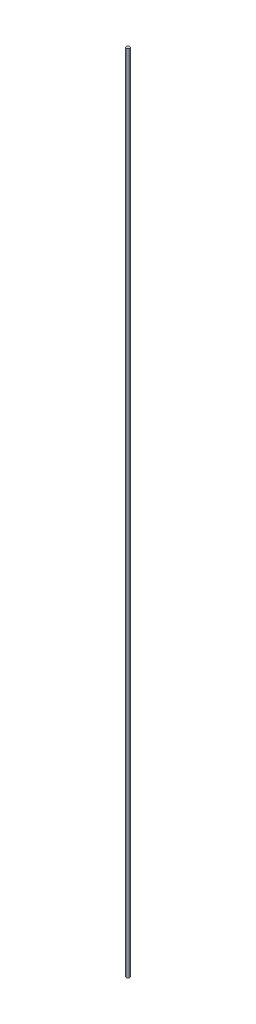
ISO-10303-21;
HEADER;
FILE_DESCRIPTION(('STEP AP214'),'2;1');
FILE_NAME('part.step','',(''),(''),'','','');
FILE_SCHEMA(('AUTOMOTIVE_DESIGN { 1 0 10303 214 1 1 1 1 }'));
ENDSEC;
DATA;
#1=APPLICATION_CONTEXT('core data for automotive mechanical design processes');
#2=APPLICATION_PROTOCOL_DEFINITION('international standard','automotive_design',2000,#1);
#3=PRODUCT_CONTEXT('',#1,'mechanical');
#4=PRODUCT('Part','Part','',(#3));
#5=PRODUCT_RELATED_PRODUCT_CATEGORY('part','',(#4));
#6=PRODUCT_DEFINITION_FORMATION('','',#4);
#7=PRODUCT_DEFINITION_CONTEXT('part definition',#1,'design');
#8=PRODUCT_DEFINITION('design','',#6,#7);
#9=PRODUCT_DEFINITION_SHAPE('','',#8);
#10=(LENGTH_UNIT() NAMED_UNIT(*) SI_UNIT(.MILLI.,.METRE.));
#11=(NAMED_UNIT(*) PLANE_ANGLE_UNIT() SI_UNIT($,.RADIAN.));
#12=(NAMED_UNIT(*) SI_UNIT($,.STERADIAN.) SOLID_ANGLE_UNIT());
#13=UNCERTAINTY_MEASURE_WITH_UNIT(LENGTH_MEASURE(1.E-05),#10,'distance_accuracy_value','');
#14=(GEOMETRIC_REPRESENTATION_CONTEXT(3) GLOBAL_UNCERTAINTY_ASSIGNED_CONTEXT((#13)) GLOBAL_UNIT_ASSIGNED_CONTEXT((#10,
#11,#12)) REPRESENTATION_CONTEXT('',''));
#15=CARTESIAN_POINT('',(0.,0.,0.));
#16=DIRECTION('',(0.,0.,1.));
#17=DIRECTION('',(1.,0.,0.));
#18=AXIS2_PLACEMENT_3D('',#15,#16,#17);
#19=CARTESIAN_POINT('',(0.,180.,0.));
#20=DIRECTION('',(0.,-1.,0.));
#21=DIRECTION('',(0.,0.,-1.));
#22=AXIS2_PLACEMENT_3D('',#19,#20,#21);
#23=CYLINDRICAL_SURFACE('',#22,0.75);
#24=CARTESIAN_POINT('',(0.,180.,0.));
#25=DIRECTION('',(0.,1.,0.));
#26=DIRECTION('',(0.,0.,1.));
#27=AXIS2_PLACEMENT_3D('',#24,#25,#26);
#28=CIRCLE('',#27,0.75);
#29=CARTESIAN_POINT('',(0.,180.,-0.75));
#30=VERTEX_POINT('',#29);
#31=EDGE_CURVE('E10',#30,#30,#28,.T.);
#32=CARTESIAN_POINT('',(0.,-180.,0.));
#33=DIRECTION('',(0.,1.,0.));
#34=DIRECTION('',(0.,0.,1.));
#35=AXIS2_PLACEMENT_3D('',#32,#33,#34);
#36=CIRCLE('',#35,0.75);
#37=CARTESIAN_POINT('',(0.,-180.,-0.75));
#38=VERTEX_POINT('',#37);
#39=EDGE_CURVE('E34',#38,#38,#36,.T.);
#40=CARTESIAN_POINT('',(0.,180.,-0.75));
#41=CARTESIAN_POINT('',(0.,176.25,-0.75));
#42=CARTESIAN_POINT('',(0.,172.5,-0.75));
#43=CARTESIAN_POINT('',(0.,165.,-0.75));
#44=CARTESIAN_POINT('',(0.,161.25,-0.75));
#45=CARTESIAN_POINT('',(0.,153.75,-0.75));
#46=CARTESIAN_POINT('',(0.,150.,-0.75));
#47=CARTESIAN_POINT('',(0.,142.5,-0.75));
#48=CARTESIAN_POINT('',(0.,138.75,-0.75));
#49=CARTESIAN_POINT('',(0.,131.25,-0.75));
#50=CARTESIAN_POINT('',(0.,127.5,-0.75));
#51=CARTESIAN_POINT('',(0.,120.,-0.75));
#52=CARTESIAN_POINT('',(0.,116.25,-0.75));
#53=CARTESIAN_POINT('',(0.,108.75,-0.75));
#54=CARTESIAN_POINT('',(0.,105.,-0.75));
#55=CARTESIAN_POINT('',(0.,97.5,-0.75));
#56=CARTESIAN_POINT('',(0.,93.75,-0.75));
#57=CARTESIAN_POINT('',(0.,86.25,-0.75));
#58=CARTESIAN_POINT('',(0.,82.5,-0.75));
#59=CARTESIAN_POINT('',(0.,75.,-0.75));
#60=CARTESIAN_POINT('',(0.,71.25,-0.75));
#61=CARTESIAN_POINT('',(0.,63.75,-0.75));
#62=CARTESIAN_POINT('',(0.,60.,-0.75));
#63=CARTESIAN_POINT('',(0.,52.5,-0.75));
#64=CARTESIAN_POINT('',(0.,48.75,-0.75));
#65=CARTESIAN_POINT('',(0.,41.25,-0.75));
#66=CARTESIAN_POINT('',(0.,37.5,-0.75));
#67=CARTESIAN_POINT('',(0.,30.,-0.75));
#68=CARTESIAN_POINT('',(0.,26.25,-0.75));
#69=CARTESIAN_POINT('',(0.,18.75,-0.75));
#70=CARTESIAN_POINT('',(0.,15.,-0.75));
#71=CARTESIAN_POINT('',(0.,7.49999999999998,-0.75));
#72=CARTESIAN_POINT('',(0.,3.74999999999998,-0.75));
#73=CARTESIAN_POINT('',(0.,-3.75000000000003,-0.75));
#74=CARTESIAN_POINT('',(0.,-7.50000000000003,-0.75));
#75=CARTESIAN_POINT('',(0.,-15.,-0.75));
#76=CARTESIAN_POINT('',(0.,-18.75,-0.75));
#77=CARTESIAN_POINT('',(0.,-26.25,-0.75));
#78=CARTESIAN_POINT('',(0.,-30.,-0.75));
#79=CARTESIAN_POINT('',(0.,-37.5,-0.75));
#80=CARTESIAN_POINT('',(0.,-41.25,-0.75));
#81=CARTESIAN_POINT('',(0.,-48.75,-0.75));
#82=CARTESIAN_POINT('',(0.,-52.5,-0.75));
#83=CARTESIAN_POINT('',(0.,-60.,-0.75));
#84=CARTESIAN_POINT('',(0.,-63.75,-0.75));
#85=CARTESIAN_POINT('',(0.,-71.25,-0.75));
#86=CARTESIAN_POINT('',(0.,-75.,-0.75));
#87=CARTESIAN_POINT('',(0.,-82.5,-0.75));
#88=CARTESIAN_POINT('',(0.,-86.25,-0.75));
#89=CARTESIAN_POINT('',(0.,-93.75,-0.75));
#90=CARTESIAN_POINT('',(0.,-97.5,-0.75));
#91=CARTESIAN_POINT('',(0.,-105.,-0.75));
#92=CARTESIAN_POINT('',(0.,-108.75,-0.75));
#93=CARTESIAN_POINT('',(0.,-116.25,-0.75));
#94=CARTESIAN_POINT('',(0.,-120.,-0.75));
#95=CARTESIAN_POINT('',(0.,-127.5,-0.75));
#96=CARTESIAN_POINT('',(0.,-131.25,-0.75));
#97=CARTESIAN_POINT('',(0.,-138.75,-0.75));
#98=CARTESIAN_POINT('',(0.,-142.5,-0.75));
#99=CARTESIAN_POINT('',(0.,-150.,-0.75));
#100=CARTESIAN_POINT('',(0.,-153.75,-0.75));
#101=CARTESIAN_POINT('',(0.,-161.25,-0.75));
#102=CARTESIAN_POINT('',(0.,-165.,-0.75));
#103=CARTESIAN_POINT('',(0.,-172.5,-0.75));
#104=CARTESIAN_POINT('',(0.,-176.25,-0.75));
#105=CARTESIAN_POINT('',(0.,-180.,-0.75));
#106=B_SPLINE_CURVE_WITH_KNOTS('',3,(#40,#41,#42,#43,#44,#45,#46,#47,#48,#49,#50,#51,#52,#53,
#54,#55,#56,#57,#58,#59,#60,#61,#62,#63,#64,#65,#66,#67,#68,#69,#70,#71,#72,#73,#74,#75,#76,#77,
#78,#79,#80,#81,#82,#83,#84,#85,#86,#87,#88,#89,#90,#91,#92,#93,#94,#95,#96,#97,#98,#99,#100,
#101,#102,#103,#104,#105),.UNSPECIFIED.,.F.,.F.,(4,2,2,2,2,2,2,2,2,2,2,2,2,2,2,2,2,2,2,2,2,2,2,
2,2,2,2,2,2,2,2,2,4),(0.,11.25,22.5,33.75,45.,56.25,67.5,78.75,90.,101.25,112.5,123.75,135.,
146.25,157.5,168.75,180.,191.25,202.5,213.75,225.,236.25,247.5,258.75,270.,281.25,292.5,303.75,
315.,326.25,337.5,348.75,360.),.UNSPECIFIED.);
#107=EDGE_CURVE('BSEAM31',#30,#38,#106,.T.);
#108=ORIENTED_EDGE('',*,*,#31,.F.);
#109=ORIENTED_EDGE('',*,*,#39,.T.);
#110=ORIENTED_EDGE('',*,*,#107,.T.);
#111=ORIENTED_EDGE('',*,*,#107,.F.);
#112=EDGE_LOOP('',(#108,#110,#109,#111));
#113=FACE_BOUND('',#112,.T.);
#114=ADVANCED_FACE('F31',(#113),#23,.T.);
#115=CARTESIAN_POINT('',(0.,180.,0.));
#116=DIRECTION('',(0.,1.,0.));
#117=DIRECTION('',(0.,0.,1.));
#118=AXIS2_PLACEMENT_3D('',#115,#116,#117);
#119=PLANE('',#118);
#120=ORIENTED_EDGE('',*,*,#31,.T.);
#121=EDGE_LOOP('',(#120));
#122=FACE_BOUND('',#121,.T.);
#123=ADVANCED_FACE('F46',(#122),#119,.T.);
#124=CARTESIAN_POINT('',(0.,-180.,0.));
#125=DIRECTION('',(0.,1.,0.));
#126=DIRECTION('',(0.,0.,1.));
#127=AXIS2_PLACEMENT_3D('',#124,#125,#126);
#128=PLANE('',#127);
#129=ORIENTED_EDGE('',*,*,#39,.F.);
#130=EDGE_LOOP('',(#129));
#131=FACE_BOUND('',#130,.T.);
#132=ADVANCED_FACE('F44',(#131),#128,.F.);
#133=CLOSED_SHELL('',(#114,#123,#132));
#134=MANIFOLD_SOLID_BREP('B2',#133);
#135=ADVANCED_BREP_SHAPE_REPRESENTATION('',(#18,#134),#14);
#136=SHAPE_DEFINITION_REPRESENTATION(#9,#135);
ENDSEC;
END-ISO-10303-21;
